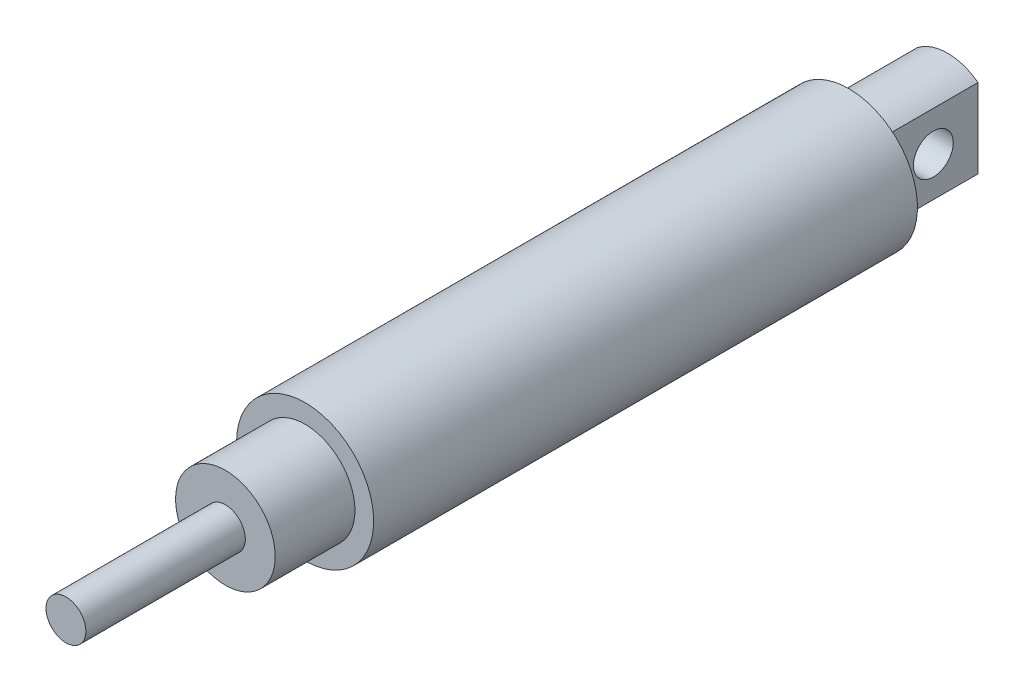
ISO-10303-21;
HEADER;
FILE_DESCRIPTION(('STEP AP214'),'2;1');
FILE_NAME('part.step','',(''),(''),'','','');
FILE_SCHEMA(('AUTOMOTIVE_DESIGN { 1 0 10303 214 1 1 1 1 }'));
ENDSEC;
DATA;
#1=APPLICATION_CONTEXT('core data for automotive mechanical design processes');
#2=APPLICATION_PROTOCOL_DEFINITION('international standard','automotive_design',2000,#1);
#3=PRODUCT_CONTEXT('',#1,'mechanical');
#4=PRODUCT('Part','Part','',(#3));
#5=PRODUCT_RELATED_PRODUCT_CATEGORY('part','',(#4));
#6=PRODUCT_DEFINITION_FORMATION('','',#4);
#7=PRODUCT_DEFINITION_CONTEXT('part definition',#1,'design');
#8=PRODUCT_DEFINITION('design','',#6,#7);
#9=PRODUCT_DEFINITION_SHAPE('','',#8);
#10=(LENGTH_UNIT() NAMED_UNIT(*) SI_UNIT(.MILLI.,.METRE.));
#11=(NAMED_UNIT(*) PLANE_ANGLE_UNIT() SI_UNIT($,.RADIAN.));
#12=(NAMED_UNIT(*) SI_UNIT($,.STERADIAN.) SOLID_ANGLE_UNIT());
#13=UNCERTAINTY_MEASURE_WITH_UNIT(LENGTH_MEASURE(1.E-05),#10,'distance_accuracy_value','');
#14=(GEOMETRIC_REPRESENTATION_CONTEXT(3) GLOBAL_UNCERTAINTY_ASSIGNED_CONTEXT((#13)) GLOBAL_UNIT_ASSIGNED_CONTEXT((#10,
#11,#12)) REPRESENTATION_CONTEXT('',''));
#15=CARTESIAN_POINT('',(0.,0.,0.));
#16=DIRECTION('',(0.,0.,1.));
#17=DIRECTION('',(1.,0.,0.));
#18=AXIS2_PLACEMENT_3D('',#15,#16,#17);
#19=CARTESIAN_POINT('',(0.,0.,124.714));
#20=DIRECTION('',(0.,0.,1.));
#21=DIRECTION('',(1.,0.,0.));
#22=AXIS2_PLACEMENT_3D('',#19,#20,#21);
#23=PLANE('',#22);
#24=CARTESIAN_POINT('',(0.,0.,124.714));
#25=DIRECTION('',(0.,0.,-1.));
#26=DIRECTION('',(-1.,0.,0.));
#27=AXIS2_PLACEMENT_3D('',#24,#25,#26);
#28=CIRCLE('',#27,3.175);
#29=CARTESIAN_POINT('',(-3.175,0.,124.714));
#30=VERTEX_POINT('',#29);
#31=EDGE_CURVE('E19',#30,#30,#28,.T.);
#32=ORIENTED_EDGE('',*,*,#31,.F.);
#33=EDGE_LOOP('',(#32));
#34=FACE_BOUND('',#33,.T.);
#35=ADVANCED_FACE('F16',(#34),#23,.T.);
#36=CARTESIAN_POINT('',(0.,0.,99.314));
#37=DIRECTION('',(0.,0.,-1.));
#38=DIRECTION('',(-1.,0.,0.));
#39=AXIS2_PLACEMENT_3D('',#36,#37,#38);
#40=CYLINDRICAL_SURFACE('',#39,3.175);
#41=CARTESIAN_POINT('',(0.,0.,99.314));
#42=DIRECTION('',(0.,0.,-1.));
#43=DIRECTION('',(-1.,0.,0.));
#44=AXIS2_PLACEMENT_3D('',#41,#42,#43);
#45=CIRCLE('',#44,3.175);
#46=CARTESIAN_POINT('',(-3.175,0.,99.314));
#47=VERTEX_POINT('',#46);
#48=EDGE_CURVE('E104',#47,#47,#45,.T.);
#49=ORIENTED_EDGE('',*,*,#48,.F.);
#50=EDGE_LOOP('',(#49));
#51=FACE_BOUND('',#50,.T.);
#52=ORIENTED_EDGE('',*,*,#31,.T.);
#53=EDGE_LOOP('',(#52));
#54=FACE_BOUND('',#53,.T.);
#55=ADVANCED_FACE('F111',(#51,#54),#40,.T.);
#56=CARTESIAN_POINT('',(0.,0.,99.314));
#57=DIRECTION('',(0.,0.,1.));
#58=DIRECTION('',(1.,0.,0.));
#59=AXIS2_PLACEMENT_3D('',#56,#57,#58);
#60=PLANE('',#59);
#61=CARTESIAN_POINT('',(0.,0.,99.314));
#62=DIRECTION('',(0.,0.,-1.));
#63=DIRECTION('',(-1.,0.,0.));
#64=AXIS2_PLACEMENT_3D('',#61,#62,#63);
#65=CIRCLE('',#64,7.9375);
#66=CARTESIAN_POINT('',(-7.9375,0.,99.314));
#67=VERTEX_POINT('',#66);
#68=EDGE_CURVE('E65',#67,#67,#65,.T.);
#69=ORIENTED_EDGE('',*,*,#68,.F.);
#70=EDGE_LOOP('',(#69));
#71=FACE_BOUND('',#70,.T.);
#72=ORIENTED_EDGE('',*,*,#48,.T.);
#73=EDGE_LOOP('',(#72));
#74=FACE_BOUND('',#73,.T.);
#75=ADVANCED_FACE('F118',(#71,#74),#60,.T.);
#76=CARTESIAN_POINT('',(4.826,0.,-8.636));
#77=DIRECTION('',(1.,0.,0.));
#78=DIRECTION('',(0.,0.,-1.));
#79=AXIS2_PLACEMENT_3D('',#76,#77,#78);
#80=CYLINDRICAL_SURFACE('',#79,3.175);
#81=CARTESIAN_POINT('',(-4.826,0.,-8.636));
#82=DIRECTION('',(1.,0.,0.));
#83=DIRECTION('',(0.,0.,-1.));
#84=AXIS2_PLACEMENT_3D('',#81,#82,#83);
#85=CIRCLE('',#84,3.175);
#86=CARTESIAN_POINT('',(-4.826,0.,-11.811));
#87=VERTEX_POINT('',#86);
#88=EDGE_CURVE('E64',#87,#87,#85,.F.);
#89=ORIENTED_EDGE('',*,*,#88,.T.);
#90=EDGE_LOOP('',(#89));
#91=FACE_BOUND('',#90,.T.);
#92=CARTESIAN_POINT('',(4.826,0.,-8.636));
#93=DIRECTION('',(1.,0.,0.));
#94=DIRECTION('',(0.,0.,-1.));
#95=AXIS2_PLACEMENT_3D('',#92,#93,#94);
#96=CIRCLE('',#95,3.175);
#97=CARTESIAN_POINT('',(4.826,0.,-11.811));
#98=VERTEX_POINT('',#97);
#99=EDGE_CURVE('E78',#98,#98,#96,.T.);
#100=ORIENTED_EDGE('',*,*,#99,.T.);
#101=EDGE_LOOP('',(#100));
#102=FACE_BOUND('',#101,.T.);
#103=ADVANCED_FACE('F153',(#91,#102),#80,.F.);
#104=CARTESIAN_POINT('',(0.,0.,-15.748));
#105=DIRECTION('',(0.,0.,-1.));
#106=DIRECTION('',(-1.,0.,0.));
#107=AXIS2_PLACEMENT_3D('',#104,#105,#106);
#108=PLANE('',#107);
#109=DIRECTION('',(0.,1.,0.));
#110=VECTOR('',#109,1.);
#111=CARTESIAN_POINT('',(4.826,25.4,-15.748));
#112=LINE('',#111,#110);
#113=CARTESIAN_POINT('',(4.826,6.30187513760785,-15.748));
#114=VERTEX_POINT('',#113);
#115=CARTESIAN_POINT('',(4.826,-6.30187513760785,-15.748));
#116=VERTEX_POINT('',#115);
#117=EDGE_CURVE('E60',#114,#116,#112,.F.);
#118=ORIENTED_EDGE('',*,*,#117,.T.);
#119=CARTESIAN_POINT('',(0.,0.,-15.748));
#120=DIRECTION('',(0.,0.,1.));
#121=DIRECTION('',(1.,0.,0.));
#122=AXIS2_PLACEMENT_3D('',#119,#120,#121);
#123=CIRCLE('',#122,7.9375);
#124=CARTESIAN_POINT('',(-4.826,-6.30187513760785,-15.748));
#125=VERTEX_POINT('',#124);
#126=EDGE_CURVE('E82',#125,#116,#123,.T.);
#127=ORIENTED_EDGE('',*,*,#126,.F.);
#128=DIRECTION('',(0.,1.,0.));
#129=VECTOR('',#128,1.);
#130=CARTESIAN_POINT('',(-4.826,-25.4,-15.748));
#131=LINE('',#130,#129);
#132=CARTESIAN_POINT('',(-4.826,6.30187513760785,-15.748));
#133=VERTEX_POINT('',#132);
#134=EDGE_CURVE('E61',#125,#133,#131,.T.);
#135=ORIENTED_EDGE('',*,*,#134,.T.);
#136=CARTESIAN_POINT('',(0.,0.,-15.748));
#137=DIRECTION('',(0.,0.,1.));
#138=DIRECTION('',(1.,0.,0.));
#139=AXIS2_PLACEMENT_3D('',#136,#137,#138);
#140=CIRCLE('',#139,7.9375);
#141=EDGE_CURVE('E55',#114,#133,#140,.T.);
#142=ORIENTED_EDGE('',*,*,#141,.F.);
#143=EDGE_LOOP('',(#118,#127,#135,#142));
#144=FACE_BOUND('',#143,.T.);
#145=ADVANCED_FACE('F57',(#144),#108,.T.);
#146=CARTESIAN_POINT('',(0.,0.,86.614));
#147=DIRECTION('',(0.,0.,-1.));
#148=DIRECTION('',(-1.,0.,0.));
#149=AXIS2_PLACEMENT_3D('',#146,#147,#148);
#150=CYLINDRICAL_SURFACE('',#149,7.9375);
#151=CARTESIAN_POINT('',(0.,0.,86.614));
#152=DIRECTION('',(0.,0.,-1.));
#153=DIRECTION('',(-1.,0.,0.));
#154=AXIS2_PLACEMENT_3D('',#151,#152,#153);
#155=CIRCLE('',#154,7.9375);
#156=CARTESIAN_POINT('',(-7.9375,0.,86.614));
#157=VERTEX_POINT('',#156);
#158=EDGE_CURVE('E74',#157,#157,#155,.T.);
#159=ORIENTED_EDGE('',*,*,#158,.F.);
#160=EDGE_LOOP('',(#159));
#161=FACE_BOUND('',#160,.T.);
#162=ORIENTED_EDGE('',*,*,#68,.T.);
#163=EDGE_LOOP('',(#162));
#164=FACE_BOUND('',#163,.T.);
#165=ADVANCED_FACE('F147',(#161,#164),#150,.T.);
#166=CARTESIAN_POINT('',(0.,0.,0.));
#167=DIRECTION('',(0.,0.,1.));
#168=DIRECTION('',(1.,0.,0.));
#169=AXIS2_PLACEMENT_3D('',#166,#167,#168);
#170=CYLINDRICAL_SURFACE('',#169,7.9375);
#171=DIRECTION('',(0.,0.,1.));
#172=VECTOR('',#171,1.);
#173=CARTESIAN_POINT('',(4.826,6.30187513760785,0.));
#174=LINE('',#173,#172);
#175=CARTESIAN_POINT('',(4.826,6.30187513760785,0.));
#176=VERTEX_POINT('',#175);
#177=EDGE_CURVE('E68',#176,#114,#174,.F.);
#178=ORIENTED_EDGE('',*,*,#177,.T.);
#179=ORIENTED_EDGE('',*,*,#141,.T.);
#180=DIRECTION('',(0.,0.,1.));
#181=VECTOR('',#180,1.);
#182=CARTESIAN_POINT('',(-4.826,6.30187513760785,0.));
#183=LINE('',#182,#181);
#184=CARTESIAN_POINT('',(-4.826,6.30187513760785,0.));
#185=VERTEX_POINT('',#184);
#186=EDGE_CURVE('E86',#133,#185,#183,.T.);
#187=ORIENTED_EDGE('',*,*,#186,.T.);
#188=CARTESIAN_POINT('',(0.,0.,0.));
#189=DIRECTION('',(0.,0.,1.));
#190=DIRECTION('',(1.,0.,0.));
#191=AXIS2_PLACEMENT_3D('',#188,#189,#190);
#192=CIRCLE('',#191,7.9375);
#193=EDGE_CURVE('E71',#176,#185,#192,.T.);
#194=ORIENTED_EDGE('',*,*,#193,.F.);
#195=EDGE_LOOP('',(#178,#179,#187,#194));
#196=FACE_BOUND('',#195,.T.);
#197=ADVANCED_FACE('F69',(#196),#170,.T.);
#198=CARTESIAN_POINT('',(-4.826,-25.4,0.));
#199=DIRECTION('',(1.,0.,0.));
#200=DIRECTION('',(0.,1.,0.));
#201=AXIS2_PLACEMENT_3D('',#198,#199,#200);
#202=PLANE('',#201);
#203=DIRECTION('',(0.,1.,0.));
#204=VECTOR('',#203,1.);
#205=CARTESIAN_POINT('',(-4.826,0.,0.));
#206=LINE('',#205,#204);
#207=CARTESIAN_POINT('',(-4.826,-6.30187513760785,0.));
#208=VERTEX_POINT('',#207);
#209=EDGE_CURVE('E95',#185,#208,#206,.F.);
#210=ORIENTED_EDGE('',*,*,#209,.F.);
#211=ORIENTED_EDGE('',*,*,#186,.F.);
#212=ORIENTED_EDGE('',*,*,#134,.F.);
#213=DIRECTION('',(0.,0.,1.));
#214=VECTOR('',#213,1.);
#215=CARTESIAN_POINT('',(-4.826,-6.30187513760785,0.));
#216=LINE('',#215,#214);
#217=EDGE_CURVE('E100',#208,#125,#216,.F.);
#218=ORIENTED_EDGE('',*,*,#217,.F.);
#219=EDGE_LOOP('',(#210,#211,#212,#218));
#220=FACE_BOUND('',#219,.T.);
#221=ORIENTED_EDGE('',*,*,#88,.F.);
#222=EDGE_LOOP('',(#221));
#223=FACE_BOUND('',#222,.T.);
#224=ADVANCED_FACE('F141',(#220,#223),#202,.F.);
#225=CARTESIAN_POINT('',(0.,0.,0.));
#226=DIRECTION('',(0.,0.,1.));
#227=DIRECTION('',(1.,0.,0.));
#228=AXIS2_PLACEMENT_3D('',#225,#226,#227);
#229=CYLINDRICAL_SURFACE('',#228,7.9375);
#230=DIRECTION('',(0.,0.,1.));
#231=VECTOR('',#230,1.);
#232=CARTESIAN_POINT('',(4.826,-6.30187513760785,0.));
#233=LINE('',#232,#231);
#234=CARTESIAN_POINT('',(4.826,-6.30187513760785,0.));
#235=VERTEX_POINT('',#234);
#236=EDGE_CURVE('E34',#116,#235,#233,.T.);
#237=ORIENTED_EDGE('',*,*,#236,.T.);
#238=CARTESIAN_POINT('',(0.,0.,0.));
#239=DIRECTION('',(0.,0.,1.));
#240=DIRECTION('',(1.,0.,0.));
#241=AXIS2_PLACEMENT_3D('',#238,#239,#240);
#242=CIRCLE('',#241,7.9375);
#243=EDGE_CURVE('E92',#208,#235,#242,.T.);
#244=ORIENTED_EDGE('',*,*,#243,.F.);
#245=ORIENTED_EDGE('',*,*,#217,.T.);
#246=ORIENTED_EDGE('',*,*,#126,.T.);
#247=EDGE_LOOP('',(#237,#244,#245,#246));
#248=FACE_BOUND('',#247,.T.);
#249=ADVANCED_FACE('F138',(#248),#229,.T.);
#250=CARTESIAN_POINT('',(4.826,25.4,0.));
#251=DIRECTION('',(-1.,0.,0.));
#252=DIRECTION('',(0.,0.,1.));
#253=AXIS2_PLACEMENT_3D('',#250,#251,#252);
#254=PLANE('',#253);
#255=DIRECTION('',(0.,1.,0.));
#256=VECTOR('',#255,1.);
#257=CARTESIAN_POINT('',(4.826,0.,0.));
#258=LINE('',#257,#256);
#259=EDGE_CURVE('E91',#235,#176,#258,.T.);
#260=ORIENTED_EDGE('',*,*,#259,.F.);
#261=ORIENTED_EDGE('',*,*,#236,.F.);
#262=ORIENTED_EDGE('',*,*,#117,.F.);
#263=ORIENTED_EDGE('',*,*,#177,.F.);
#264=EDGE_LOOP('',(#260,#261,#262,#263));
#265=FACE_BOUND('',#264,.T.);
#266=ORIENTED_EDGE('',*,*,#99,.F.);
#267=EDGE_LOOP('',(#266));
#268=FACE_BOUND('',#267,.T.);
#269=ADVANCED_FACE('F76',(#265,#268),#254,.F.);
#270=CARTESIAN_POINT('',(0.,0.,86.614));
#271=DIRECTION('',(0.,0.,1.));
#272=DIRECTION('',(1.,0.,0.));
#273=AXIS2_PLACEMENT_3D('',#270,#271,#272);
#274=PLANE('',#273);
#275=CARTESIAN_POINT('',(0.,0.,86.614));
#276=DIRECTION('',(0.,0.,-1.));
#277=DIRECTION('',(-1.,0.,0.));
#278=AXIS2_PLACEMENT_3D('',#275,#276,#277);
#279=CIRCLE('',#278,10.922);
#280=CARTESIAN_POINT('',(-10.922,0.,86.614));
#281=VERTEX_POINT('',#280);
#282=EDGE_CURVE('E25',#281,#281,#279,.T.);
#283=ORIENTED_EDGE('',*,*,#282,.F.);
#284=EDGE_LOOP('',(#283));
#285=FACE_BOUND('',#284,.T.);
#286=ORIENTED_EDGE('',*,*,#158,.T.);
#287=EDGE_LOOP('',(#286));
#288=FACE_BOUND('',#287,.T.);
#289=ADVANCED_FACE('F128',(#285,#288),#274,.T.);
#290=CARTESIAN_POINT('',(0.,0.,0.));
#291=DIRECTION('',(0.,0.,-1.));
#292=DIRECTION('',(-1.,0.,0.));
#293=AXIS2_PLACEMENT_3D('',#290,#291,#292);
#294=PLANE('',#293);
#295=CARTESIAN_POINT('',(0.,0.,0.));
#296=DIRECTION('',(0.,0.,-1.));
#297=DIRECTION('',(-1.,0.,0.));
#298=AXIS2_PLACEMENT_3D('',#295,#296,#297);
#299=CIRCLE('',#298,10.922);
#300=CARTESIAN_POINT('',(-10.922,0.,0.));
#301=VERTEX_POINT('',#300);
#302=EDGE_CURVE('E11',#301,#301,#299,.F.);
#303=ORIENTED_EDGE('',*,*,#302,.F.);
#304=EDGE_LOOP('',(#303));
#305=FACE_BOUND('',#304,.T.);
#306=ORIENTED_EDGE('',*,*,#243,.T.);
#307=ORIENTED_EDGE('',*,*,#259,.T.);
#308=ORIENTED_EDGE('',*,*,#193,.T.);
#309=ORIENTED_EDGE('',*,*,#209,.T.);
#310=EDGE_LOOP('',(#306,#307,#308,#309));
#311=FACE_BOUND('',#310,.T.);
#312=ADVANCED_FACE('F122',(#305,#311),#294,.T.);
#313=CARTESIAN_POINT('',(0.,0.,0.));
#314=DIRECTION('',(0.,0.,-1.));
#315=DIRECTION('',(-1.,0.,0.));
#316=AXIS2_PLACEMENT_3D('',#313,#314,#315);
#317=CYLINDRICAL_SURFACE('',#316,10.922);
#318=ORIENTED_EDGE('',*,*,#302,.T.);
#319=EDGE_LOOP('',(#318));
#320=FACE_BOUND('',#319,.T.);
#321=ORIENTED_EDGE('',*,*,#282,.T.);
#322=EDGE_LOOP('',(#321));
#323=FACE_BOUND('',#322,.T.);
#324=ADVANCED_FACE('F120',(#320,#323),#317,.T.);
#325=CLOSED_SHELL('',(#35,#55,#75,#103,#145,#165,#197,#224,#249,#269,#289,#312,#324));
#326=MANIFOLD_SOLID_BREP('B1',#325);
#327=ADVANCED_BREP_SHAPE_REPRESENTATION('',(#18,#326),#14);
#328=SHAPE_DEFINITION_REPRESENTATION(#9,#327);
ENDSEC;
END-ISO-10303-21;
